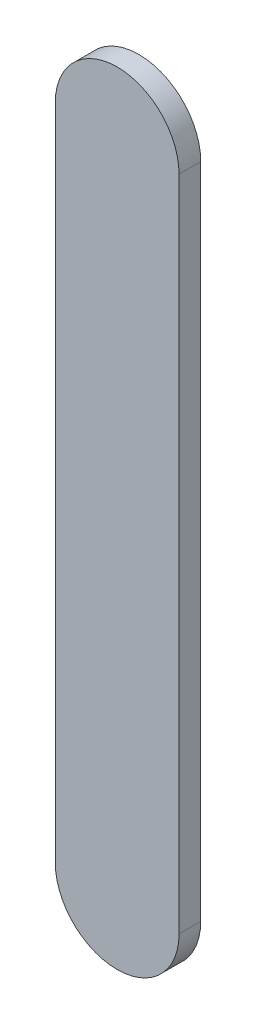
ISO-10303-21;
HEADER;
FILE_DESCRIPTION(('STEP AP214'),'2;1');
FILE_NAME('part.step','',(''),(''),'','','');
FILE_SCHEMA(('AUTOMOTIVE_DESIGN { 1 0 10303 214 1 1 1 1 }'));
ENDSEC;
DATA;
#1=APPLICATION_CONTEXT('core data for automotive mechanical design processes');
#2=APPLICATION_PROTOCOL_DEFINITION('international standard','automotive_design',2000,#1);
#3=PRODUCT_CONTEXT('',#1,'mechanical');
#4=PRODUCT('Part','Part','',(#3));
#5=PRODUCT_RELATED_PRODUCT_CATEGORY('part','',(#4));
#6=PRODUCT_DEFINITION_FORMATION('','',#4);
#7=PRODUCT_DEFINITION_CONTEXT('part definition',#1,'design');
#8=PRODUCT_DEFINITION('design','',#6,#7);
#9=PRODUCT_DEFINITION_SHAPE('','',#8);
#10=(LENGTH_UNIT() NAMED_UNIT(*) SI_UNIT(.MILLI.,.METRE.));
#11=(NAMED_UNIT(*) PLANE_ANGLE_UNIT() SI_UNIT($,.RADIAN.));
#12=(NAMED_UNIT(*) SI_UNIT($,.STERADIAN.) SOLID_ANGLE_UNIT());
#13=UNCERTAINTY_MEASURE_WITH_UNIT(LENGTH_MEASURE(1.E-05),#10,'distance_accuracy_value','');
#14=(GEOMETRIC_REPRESENTATION_CONTEXT(3) GLOBAL_UNCERTAINTY_ASSIGNED_CONTEXT((#13)) GLOBAL_UNIT_ASSIGNED_CONTEXT((#10,
#11,#12)) REPRESENTATION_CONTEXT('',''));
#15=CARTESIAN_POINT('',(0.,0.,0.));
#16=DIRECTION('',(0.,0.,1.));
#17=DIRECTION('',(1.,0.,0.));
#18=AXIS2_PLACEMENT_3D('',#15,#16,#17);
#19=CARTESIAN_POINT('',(113.281,-121.284,1.635));
#20=DIRECTION('',(0.,0.,1.));
#21=DIRECTION('',(1.,0.,0.));
#22=AXIS2_PLACEMENT_3D('',#19,#20,#21);
#23=PLANE('',#22);
#24=DIRECTION('',(0.,1.,0.));
#25=VECTOR('',#24,1.);
#26=CARTESIAN_POINT('',(113.281,-121.284,1.635));
#27=LINE('',#26,#25);
#28=CARTESIAN_POINT('',(113.281,-121.284,1.635));
#29=VERTEX_POINT('',#28);
#30=CARTESIAN_POINT('',(113.281,-120.221,1.635));
#31=VERTEX_POINT('',#30);
#32=EDGE_CURVE('E93',#29,#31,#27,.T.);
#33=ORIENTED_EDGE('',*,*,#32,.T.);
#34=CARTESIAN_POINT('',(113.181,-120.221,1.635));
#35=DIRECTION('',(0.,0.,1.));
#36=DIRECTION('',(1.,-1.42108547152E-13,0.));
#37=AXIS2_PLACEMENT_3D('',#34,#35,#36);
#38=CIRCLE('',#37,0.1);
#39=CARTESIAN_POINT('',(113.081,-120.221,1.635));
#40=VERTEX_POINT('',#39);
#41=EDGE_CURVE('E71',#31,#40,#38,.T.);
#42=ORIENTED_EDGE('',*,*,#41,.T.);
#43=DIRECTION('',(0.,-1.,0.));
#44=VECTOR('',#43,1.);
#45=CARTESIAN_POINT('',(113.081,-120.221,1.635));
#46=LINE('',#45,#44);
#47=CARTESIAN_POINT('',(113.081,-121.284,1.635));
#48=VERTEX_POINT('',#47);
#49=EDGE_CURVE('E87',#40,#48,#46,.T.);
#50=ORIENTED_EDGE('',*,*,#49,.T.);
#51=CARTESIAN_POINT('',(113.181,-121.284,1.635));
#52=DIRECTION('',(0.,0.,1.));
#53=DIRECTION('',(-1.,0.,0.));
#54=AXIS2_PLACEMENT_3D('',#51,#52,#53);
#55=CIRCLE('',#54,0.1);
#56=EDGE_CURVE('E11',#48,#29,#55,.T.);
#57=ORIENTED_EDGE('',*,*,#56,.T.);
#58=EDGE_LOOP('',(#33,#42,#50,#57));
#59=FACE_BOUND('',#58,.T.);
#60=ADVANCED_FACE('F17',(#59),#23,.T.);
#61=CARTESIAN_POINT('',(113.281,-121.284,1.6));
#62=DIRECTION('',(0.,0.,1.));
#63=DIRECTION('',(1.,0.,0.));
#64=AXIS2_PLACEMENT_3D('',#61,#62,#63);
#65=PLANE('',#64);
#66=CARTESIAN_POINT('',(113.181,-121.284,1.6));
#67=DIRECTION('',(0.,0.,1.));
#68=DIRECTION('',(-1.,0.,0.));
#69=AXIS2_PLACEMENT_3D('',#66,#67,#68);
#70=CIRCLE('',#69,0.1);
#71=CARTESIAN_POINT('',(113.081,-121.284,1.6));
#72=VERTEX_POINT('',#71);
#73=CARTESIAN_POINT('',(113.281,-121.284,1.6));
#74=VERTEX_POINT('',#73);
#75=EDGE_CURVE('E27',#72,#74,#70,.T.);
#76=ORIENTED_EDGE('',*,*,#75,.F.);
#77=DIRECTION('',(0.,-1.,0.));
#78=VECTOR('',#77,1.);
#79=CARTESIAN_POINT('',(113.081,-120.221,1.6));
#80=LINE('',#79,#78);
#81=CARTESIAN_POINT('',(113.081,-120.221,1.6));
#82=VERTEX_POINT('',#81);
#83=EDGE_CURVE('E106',#82,#72,#80,.T.);
#84=ORIENTED_EDGE('',*,*,#83,.F.);
#85=CARTESIAN_POINT('',(113.181,-120.221,1.6));
#86=DIRECTION('',(0.,0.,1.));
#87=DIRECTION('',(1.,-1.42108547152E-13,0.));
#88=AXIS2_PLACEMENT_3D('',#85,#86,#87);
#89=CIRCLE('',#88,0.1);
#90=CARTESIAN_POINT('',(113.281,-120.221,1.6));
#91=VERTEX_POINT('',#90);
#92=EDGE_CURVE('E77',#91,#82,#89,.T.);
#93=ORIENTED_EDGE('',*,*,#92,.F.);
#94=DIRECTION('',(0.,1.,0.));
#95=VECTOR('',#94,1.);
#96=CARTESIAN_POINT('',(113.281,-121.284,1.6));
#97=LINE('',#96,#95);
#98=EDGE_CURVE('E92',#74,#91,#97,.T.);
#99=ORIENTED_EDGE('',*,*,#98,.F.);
#100=EDGE_LOOP('',(#76,#84,#93,#99));
#101=FACE_BOUND('',#100,.T.);
#102=ADVANCED_FACE('F96',(#101),#65,.F.);
#103=CARTESIAN_POINT('',(113.181,-121.284,1.6));
#104=DIRECTION('',(0.,0.,-1.));
#105=DIRECTION('',(-1.,0.,0.));
#106=AXIS2_PLACEMENT_3D('',#103,#104,#105);
#107=CYLINDRICAL_SURFACE('',#106,0.1);
#108=ORIENTED_EDGE('',*,*,#75,.T.);
#109=DIRECTION('',(0.,0.,1.));
#110=VECTOR('',#109,1.);
#111=CARTESIAN_POINT('',(113.281,-121.284,1.6));
#112=LINE('',#111,#110);
#113=EDGE_CURVE('E82',#74,#29,#112,.T.);
#114=ORIENTED_EDGE('',*,*,#113,.T.);
#115=ORIENTED_EDGE('',*,*,#56,.F.);
#116=DIRECTION('',(0.,0.,1.));
#117=VECTOR('',#116,1.);
#118=CARTESIAN_POINT('',(113.081,-121.284,1.6));
#119=LINE('',#118,#117);
#120=EDGE_CURVE('E21',#72,#48,#119,.T.);
#121=ORIENTED_EDGE('',*,*,#120,.F.);
#122=EDGE_LOOP('',(#108,#114,#115,#121));
#123=FACE_BOUND('',#122,.T.);
#124=ADVANCED_FACE('F19',(#123),#107,.T.);
#125=CARTESIAN_POINT('',(113.081,-120.221,1.6));
#126=DIRECTION('',(1.,0.,0.));
#127=DIRECTION('',(0.,1.,0.));
#128=AXIS2_PLACEMENT_3D('',#125,#126,#127);
#129=PLANE('',#128);
#130=ORIENTED_EDGE('',*,*,#83,.T.);
#131=ORIENTED_EDGE('',*,*,#120,.T.);
#132=ORIENTED_EDGE('',*,*,#49,.F.);
#133=DIRECTION('',(0.,0.,1.));
#134=VECTOR('',#133,1.);
#135=CARTESIAN_POINT('',(113.081,-120.221,1.6));
#136=LINE('',#135,#134);
#137=EDGE_CURVE('E113',#82,#40,#136,.T.);
#138=ORIENTED_EDGE('',*,*,#137,.F.);
#139=EDGE_LOOP('',(#130,#131,#132,#138));
#140=FACE_BOUND('',#139,.T.);
#141=ADVANCED_FACE('F122',(#140),#129,.F.);
#142=CARTESIAN_POINT('',(113.181,-120.221,1.6));
#143=DIRECTION('',(0.,0.,-1.));
#144=DIRECTION('',(1.,-1.42108547152E-13,0.));
#145=AXIS2_PLACEMENT_3D('',#142,#143,#144);
#146=CYLINDRICAL_SURFACE('',#145,0.1);
#147=ORIENTED_EDGE('',*,*,#92,.T.);
#148=ORIENTED_EDGE('',*,*,#137,.T.);
#149=ORIENTED_EDGE('',*,*,#41,.F.);
#150=DIRECTION('',(0.,0.,1.));
#151=VECTOR('',#150,1.);
#152=CARTESIAN_POINT('',(113.281,-120.221,1.6));
#153=LINE('',#152,#151);
#154=EDGE_CURVE('E98',#91,#31,#153,.T.);
#155=ORIENTED_EDGE('',*,*,#154,.F.);
#156=EDGE_LOOP('',(#147,#148,#149,#155));
#157=FACE_BOUND('',#156,.T.);
#158=ADVANCED_FACE('F120',(#157),#146,.T.);
#159=CARTESIAN_POINT('',(113.281,-121.284,1.6));
#160=DIRECTION('',(-1.,0.,0.));
#161=DIRECTION('',(0.,0.,1.));
#162=AXIS2_PLACEMENT_3D('',#159,#160,#161);
#163=PLANE('',#162);
#164=ORIENTED_EDGE('',*,*,#98,.T.);
#165=ORIENTED_EDGE('',*,*,#154,.T.);
#166=ORIENTED_EDGE('',*,*,#32,.F.);
#167=ORIENTED_EDGE('',*,*,#113,.F.);
#168=EDGE_LOOP('',(#164,#165,#166,#167));
#169=FACE_BOUND('',#168,.T.);
#170=ADVANCED_FACE('F90',(#169),#163,.F.);
#171=CLOSED_SHELL('',(#60,#102,#124,#141,#158,#170));
#172=MANIFOLD_SOLID_BREP('B1',#171);
#173=ADVANCED_BREP_SHAPE_REPRESENTATION('',(#18,#172),#14);
#174=SHAPE_DEFINITION_REPRESENTATION(#9,#173);
ENDSEC;
END-ISO-10303-21;
